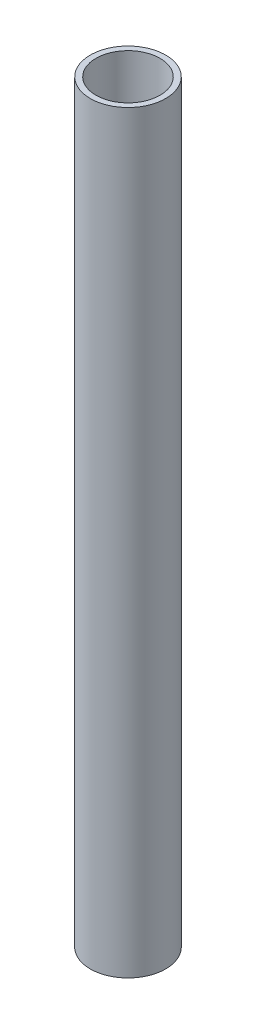
ISO-10303-21;
HEADER;
FILE_DESCRIPTION(('STEP AP214'),'2;1');
FILE_NAME('part.step','',(''),(''),'','','');
FILE_SCHEMA(('AUTOMOTIVE_DESIGN { 1 0 10303 214 1 1 1 1 }'));
ENDSEC;
DATA;
#1=APPLICATION_CONTEXT('core data for automotive mechanical design processes');
#2=APPLICATION_PROTOCOL_DEFINITION('international standard','automotive_design',2000,#1);
#3=PRODUCT_CONTEXT('',#1,'mechanical');
#4=PRODUCT('Part','Part','',(#3));
#5=PRODUCT_RELATED_PRODUCT_CATEGORY('part','',(#4));
#6=PRODUCT_DEFINITION_FORMATION('','',#4);
#7=PRODUCT_DEFINITION_CONTEXT('part definition',#1,'design');
#8=PRODUCT_DEFINITION('design','',#6,#7);
#9=PRODUCT_DEFINITION_SHAPE('','',#8);
#10=(LENGTH_UNIT() NAMED_UNIT(*) SI_UNIT(.MILLI.,.METRE.));
#11=(NAMED_UNIT(*) PLANE_ANGLE_UNIT() SI_UNIT($,.RADIAN.));
#12=(NAMED_UNIT(*) SI_UNIT($,.STERADIAN.) SOLID_ANGLE_UNIT());
#13=UNCERTAINTY_MEASURE_WITH_UNIT(LENGTH_MEASURE(1.E-05),#10,'distance_accuracy_value','');
#14=(GEOMETRIC_REPRESENTATION_CONTEXT(3) GLOBAL_UNCERTAINTY_ASSIGNED_CONTEXT((#13)) GLOBAL_UNIT_ASSIGNED_CONTEXT((#10,
#11,#12)) REPRESENTATION_CONTEXT('',''));
#15=CARTESIAN_POINT('',(0.,0.,0.));
#16=DIRECTION('',(0.,0.,1.));
#17=DIRECTION('',(1.,0.,0.));
#18=AXIS2_PLACEMENT_3D('',#15,#16,#17);
#19=CARTESIAN_POINT('',(0.,320.,0.));
#20=DIRECTION('',(0.,1.,0.));
#21=DIRECTION('',(0.,0.,1.));
#22=AXIS2_PLACEMENT_3D('',#19,#20,#21);
#23=PLANE('',#22);
#24=CARTESIAN_POINT('',(0.,320.,0.));
#25=DIRECTION('',(0.,1.,0.));
#26=DIRECTION('',(0.,0.,1.));
#27=AXIS2_PLACEMENT_3D('',#24,#25,#26);
#28=CIRCLE('',#27,16.);
#29=CARTESIAN_POINT('',(0.,320.,16.));
#30=VERTEX_POINT('',#29);
#31=EDGE_CURVE('E10',#30,#30,#28,.T.);
#32=ORIENTED_EDGE('',*,*,#31,.T.);
#33=EDGE_LOOP('',(#32));
#34=FACE_BOUND('',#33,.T.);
#35=CARTESIAN_POINT('',(0.,320.,0.));
#36=DIRECTION('',(0.,1.,0.));
#37=DIRECTION('',(0.,0.,1.));
#38=AXIS2_PLACEMENT_3D('',#35,#36,#37);
#39=CIRCLE('',#38,13.6);
#40=CARTESIAN_POINT('',(0.,320.,13.6));
#41=VERTEX_POINT('',#40);
#42=EDGE_CURVE('E50',#41,#41,#39,.T.);
#43=ORIENTED_EDGE('',*,*,#42,.F.);
#44=EDGE_LOOP('',(#43));
#45=FACE_BOUND('',#44,.T.);
#46=ADVANCED_FACE('F39',(#34,#45),#23,.T.);
#47=CARTESIAN_POINT('',(0.,0.,0.));
#48=DIRECTION('',(0.,1.,0.));
#49=DIRECTION('',(0.,0.,1.));
#50=AXIS2_PLACEMENT_3D('',#47,#48,#49);
#51=PLANE('',#50);
#52=CARTESIAN_POINT('',(0.,0.,0.));
#53=DIRECTION('',(0.,1.,0.));
#54=DIRECTION('',(0.,0.,1.));
#55=AXIS2_PLACEMENT_3D('',#52,#53,#54);
#56=CIRCLE('',#55,16.);
#57=CARTESIAN_POINT('',(0.,0.,16.));
#58=VERTEX_POINT('',#57);
#59=EDGE_CURVE('E43',#58,#58,#56,.T.);
#60=ORIENTED_EDGE('',*,*,#59,.F.);
#61=EDGE_LOOP('',(#60));
#62=FACE_BOUND('',#61,.T.);
#63=CARTESIAN_POINT('',(0.,0.,0.));
#64=DIRECTION('',(0.,1.,0.));
#65=DIRECTION('',(0.,0.,1.));
#66=AXIS2_PLACEMENT_3D('',#63,#64,#65);
#67=CIRCLE('',#66,13.6);
#68=CARTESIAN_POINT('',(0.,0.,13.6));
#69=VERTEX_POINT('',#68);
#70=EDGE_CURVE('E52',#69,#69,#67,.T.);
#71=ORIENTED_EDGE('',*,*,#70,.T.);
#72=EDGE_LOOP('',(#71));
#73=FACE_BOUND('',#72,.T.);
#74=ADVANCED_FACE('F62',(#62,#73),#51,.F.);
#75=CARTESIAN_POINT('',(0.,320.,0.));
#76=DIRECTION('',(0.,-1.,0.));
#77=DIRECTION('',(0.,0.,-1.));
#78=AXIS2_PLACEMENT_3D('',#75,#76,#77);
#79=CYLINDRICAL_SURFACE('',#78,16.);
#80=ORIENTED_EDGE('',*,*,#31,.F.);
#81=EDGE_LOOP('',(#80));
#82=FACE_BOUND('',#81,.T.);
#83=ORIENTED_EDGE('',*,*,#59,.T.);
#84=EDGE_LOOP('',(#83));
#85=FACE_BOUND('',#84,.T.);
#86=ADVANCED_FACE('F41',(#82,#85),#79,.T.);
#87=CARTESIAN_POINT('',(0.,320.,0.));
#88=DIRECTION('',(0.,-1.,0.));
#89=DIRECTION('',(0.,0.,-1.));
#90=AXIS2_PLACEMENT_3D('',#87,#88,#89);
#91=CYLINDRICAL_SURFACE('',#90,13.6);
#92=ORIENTED_EDGE('',*,*,#42,.T.);
#93=EDGE_LOOP('',(#92));
#94=FACE_BOUND('',#93,.T.);
#95=ORIENTED_EDGE('',*,*,#70,.F.);
#96=EDGE_LOOP('',(#95));
#97=FACE_BOUND('',#96,.T.);
#98=ADVANCED_FACE('F58',(#94,#97),#91,.F.);
#99=CLOSED_SHELL('',(#46,#74,#86,#98));
#100=MANIFOLD_SOLID_BREP('B2',#99);
#101=ADVANCED_BREP_SHAPE_REPRESENTATION('',(#18,#100),#14);
#102=SHAPE_DEFINITION_REPRESENTATION(#9,#101);
ENDSEC;
END-ISO-10303-21;
